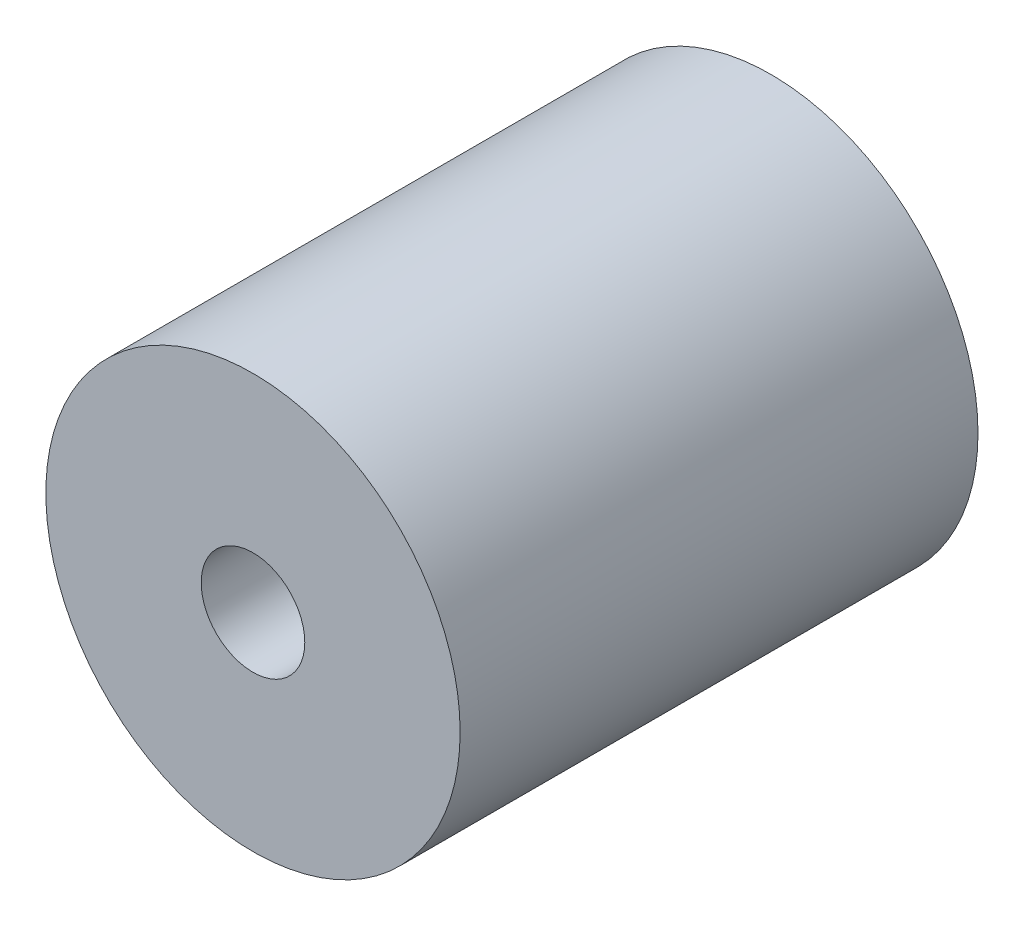
ISO-10303-21;
HEADER;
FILE_DESCRIPTION(('STEP AP214'),'2;1');
FILE_NAME('part.step','',(''),(''),'','','');
FILE_SCHEMA(('AUTOMOTIVE_DESIGN { 1 0 10303 214 1 1 1 1 }'));
ENDSEC;
DATA;
#1=APPLICATION_CONTEXT('core data for automotive mechanical design processes');
#2=APPLICATION_PROTOCOL_DEFINITION('international standard','automotive_design',2000,#1);
#3=PRODUCT_CONTEXT('',#1,'mechanical');
#4=PRODUCT('Part','Part','',(#3));
#5=PRODUCT_RELATED_PRODUCT_CATEGORY('part','',(#4));
#6=PRODUCT_DEFINITION_FORMATION('','',#4);
#7=PRODUCT_DEFINITION_CONTEXT('part definition',#1,'design');
#8=PRODUCT_DEFINITION('design','',#6,#7);
#9=PRODUCT_DEFINITION_SHAPE('','',#8);
#10=(LENGTH_UNIT() NAMED_UNIT(*) SI_UNIT(.MILLI.,.METRE.));
#11=(NAMED_UNIT(*) PLANE_ANGLE_UNIT() SI_UNIT($,.RADIAN.));
#12=(NAMED_UNIT(*) SI_UNIT($,.STERADIAN.) SOLID_ANGLE_UNIT());
#13=UNCERTAINTY_MEASURE_WITH_UNIT(LENGTH_MEASURE(1.E-05),#10,'distance_accuracy_value','');
#14=(GEOMETRIC_REPRESENTATION_CONTEXT(3) GLOBAL_UNCERTAINTY_ASSIGNED_CONTEXT((#13)) GLOBAL_UNIT_ASSIGNED_CONTEXT((#10,
#11,#12)) REPRESENTATION_CONTEXT('',''));
#15=CARTESIAN_POINT('',(0.,0.,0.));
#16=DIRECTION('',(0.,0.,1.));
#17=DIRECTION('',(1.,0.,0.));
#18=AXIS2_PLACEMENT_3D('',#15,#16,#17);
#19=CARTESIAN_POINT('',(0.,0.,25.));
#20=DIRECTION('',(0.,0.,1.));
#21=DIRECTION('',(1.,0.,0.));
#22=AXIS2_PLACEMENT_3D('',#19,#20,#21);
#23=PLANE('',#22);
#24=CARTESIAN_POINT('',(0.,0.,25.));
#25=DIRECTION('',(0.,0.,1.));
#26=DIRECTION('',(1.,0.,0.));
#27=AXIS2_PLACEMENT_3D('',#24,#25,#26);
#28=CIRCLE('',#27,10.);
#29=CARTESIAN_POINT('',(10.,0.,25.));
#30=VERTEX_POINT('',#29);
#31=EDGE_CURVE('E10',#30,#30,#28,.T.);
#32=ORIENTED_EDGE('',*,*,#31,.T.);
#33=EDGE_LOOP('',(#32));
#34=FACE_BOUND('',#33,.T.);
#35=CARTESIAN_POINT('',(0.,0.,25.));
#36=DIRECTION('',(0.,0.,1.));
#37=DIRECTION('',(1.,0.,0.));
#38=AXIS2_PLACEMENT_3D('',#35,#36,#37);
#39=CIRCLE('',#38,2.5);
#40=CARTESIAN_POINT('',(2.5,0.,25.));
#41=VERTEX_POINT('',#40);
#42=EDGE_CURVE('E44',#41,#41,#39,.T.);
#43=ORIENTED_EDGE('',*,*,#42,.F.);
#44=EDGE_LOOP('',(#43));
#45=FACE_BOUND('',#44,.T.);
#46=ADVANCED_FACE('F33',(#34,#45),#23,.T.);
#47=CARTESIAN_POINT('',(0.,0.,0.));
#48=DIRECTION('',(0.,0.,1.));
#49=DIRECTION('',(1.,0.,0.));
#50=AXIS2_PLACEMENT_3D('',#47,#48,#49);
#51=PLANE('',#50);
#52=CARTESIAN_POINT('',(0.,0.,0.));
#53=DIRECTION('',(0.,0.,1.));
#54=DIRECTION('',(1.,0.,0.));
#55=AXIS2_PLACEMENT_3D('',#52,#53,#54);
#56=CIRCLE('',#55,10.);
#57=CARTESIAN_POINT('',(10.,0.,0.));
#58=VERTEX_POINT('',#57);
#59=EDGE_CURVE('E37',#58,#58,#56,.T.);
#60=ORIENTED_EDGE('',*,*,#59,.F.);
#61=EDGE_LOOP('',(#60));
#62=FACE_BOUND('',#61,.T.);
#63=CARTESIAN_POINT('',(0.,0.,0.));
#64=DIRECTION('',(0.,0.,1.));
#65=DIRECTION('',(1.,0.,0.));
#66=AXIS2_PLACEMENT_3D('',#63,#64,#65);
#67=CIRCLE('',#66,2.5);
#68=CARTESIAN_POINT('',(2.5,0.,0.));
#69=VERTEX_POINT('',#68);
#70=EDGE_CURVE('E46',#69,#69,#67,.T.);
#71=ORIENTED_EDGE('',*,*,#70,.T.);
#72=EDGE_LOOP('',(#71));
#73=FACE_BOUND('',#72,.T.);
#74=ADVANCED_FACE('F56',(#62,#73),#51,.F.);
#75=CARTESIAN_POINT('',(0.,0.,25.));
#76=DIRECTION('',(0.,0.,-1.));
#77=DIRECTION('',(-1.,0.,0.));
#78=AXIS2_PLACEMENT_3D('',#75,#76,#77);
#79=CYLINDRICAL_SURFACE('',#78,10.);
#80=ORIENTED_EDGE('',*,*,#31,.F.);
#81=EDGE_LOOP('',(#80));
#82=FACE_BOUND('',#81,.T.);
#83=ORIENTED_EDGE('',*,*,#59,.T.);
#84=EDGE_LOOP('',(#83));
#85=FACE_BOUND('',#84,.T.);
#86=ADVANCED_FACE('F35',(#82,#85),#79,.T.);
#87=CARTESIAN_POINT('',(0.,0.,25.));
#88=DIRECTION('',(0.,0.,-1.));
#89=DIRECTION('',(-1.,0.,0.));
#90=AXIS2_PLACEMENT_3D('',#87,#88,#89);
#91=CYLINDRICAL_SURFACE('',#90,2.5);
#92=ORIENTED_EDGE('',*,*,#42,.T.);
#93=EDGE_LOOP('',(#92));
#94=FACE_BOUND('',#93,.T.);
#95=ORIENTED_EDGE('',*,*,#70,.F.);
#96=EDGE_LOOP('',(#95));
#97=FACE_BOUND('',#96,.T.);
#98=ADVANCED_FACE('F52',(#94,#97),#91,.F.);
#99=CLOSED_SHELL('',(#46,#74,#86,#98));
#100=MANIFOLD_SOLID_BREP('B2',#99);
#101=ADVANCED_BREP_SHAPE_REPRESENTATION('',(#18,#100),#14);
#102=SHAPE_DEFINITION_REPRESENTATION(#9,#101);
ENDSEC;
END-ISO-10303-21;
